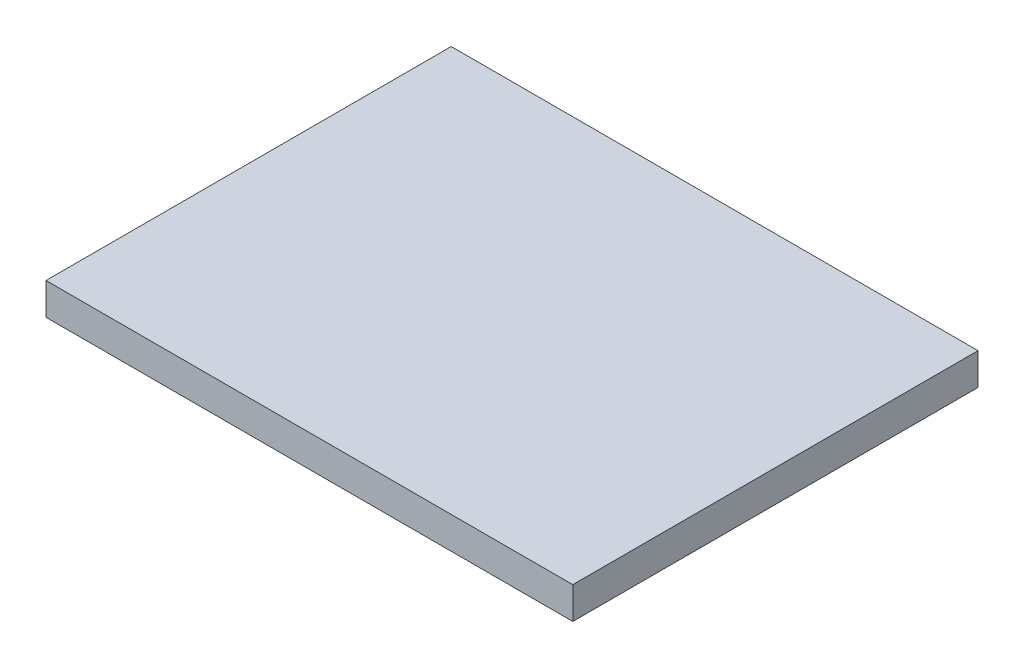
ISO-10303-21;
HEADER;
FILE_DESCRIPTION(('STEP AP214'),'2;1');
FILE_NAME('part.step','',(''),(''),'','','');
FILE_SCHEMA(('AUTOMOTIVE_DESIGN { 1 0 10303 214 1 1 1 1 }'));
ENDSEC;
DATA;
#1=APPLICATION_CONTEXT('core data for automotive mechanical design processes');
#2=APPLICATION_PROTOCOL_DEFINITION('international standard','automotive_design',2000,#1);
#3=PRODUCT_CONTEXT('',#1,'mechanical');
#4=PRODUCT('Part','Part','',(#3));
#5=PRODUCT_RELATED_PRODUCT_CATEGORY('part','',(#4));
#6=PRODUCT_DEFINITION_FORMATION('','',#4);
#7=PRODUCT_DEFINITION_CONTEXT('part definition',#1,'design');
#8=PRODUCT_DEFINITION('design','',#6,#7);
#9=PRODUCT_DEFINITION_SHAPE('','',#8);
#10=(LENGTH_UNIT() NAMED_UNIT(*) SI_UNIT(.MILLI.,.METRE.));
#11=(NAMED_UNIT(*) PLANE_ANGLE_UNIT() SI_UNIT($,.RADIAN.));
#12=(NAMED_UNIT(*) SI_UNIT($,.STERADIAN.) SOLID_ANGLE_UNIT());
#13=UNCERTAINTY_MEASURE_WITH_UNIT(LENGTH_MEASURE(1.E-05),#10,'distance_accuracy_value','');
#14=(GEOMETRIC_REPRESENTATION_CONTEXT(3) GLOBAL_UNCERTAINTY_ASSIGNED_CONTEXT((#13)) GLOBAL_UNIT_ASSIGNED_CONTEXT((#10,
#11,#12)) REPRESENTATION_CONTEXT('',''));
#15=CARTESIAN_POINT('',(0.,0.,0.));
#16=DIRECTION('',(0.,0.,1.));
#17=DIRECTION('',(1.,0.,0.));
#18=AXIS2_PLACEMENT_3D('',#15,#16,#17);
#19=CARTESIAN_POINT('',(-104.16403785489,10.,-64.8020504731861));
#20=DIRECTION('',(1.,0.,0.));
#21=DIRECTION('',(0.,0.,-1.));
#22=AXIS2_PLACEMENT_3D('',#19,#20,#21);
#23=PLANE('',#22);
#24=DIRECTION('',(0.,0.,1.));
#25=VECTOR('',#24,1.);
#26=CARTESIAN_POINT('',(-104.16403785489,0.,-64.8020504731861));
#27=LINE('',#26,#25);
#28=CARTESIAN_POINT('',(-104.16403785489,0.,-64.8020504731861));
#29=VERTEX_POINT('',#28);
#30=CARTESIAN_POINT('',(-104.16403785489,0.,62.1979495268139));
#31=VERTEX_POINT('',#30);
#32=EDGE_CURVE('E100',#29,#31,#27,.T.);
#33=ORIENTED_EDGE('',*,*,#32,.T.);
#34=DIRECTION('',(0.,-1.,0.));
#35=VECTOR('',#34,1.);
#36=CARTESIAN_POINT('',(-104.16403785489,10.,62.1979495268139));
#37=LINE('',#36,#35);
#38=CARTESIAN_POINT('',(-104.16403785489,10.,62.1979495268139));
#39=VERTEX_POINT('',#38);
#40=EDGE_CURVE('E11',#39,#31,#37,.T.);
#41=ORIENTED_EDGE('',*,*,#40,.F.);
#42=DIRECTION('',(0.,0.,1.));
#43=VECTOR('',#42,1.);
#44=CARTESIAN_POINT('',(-104.16403785489,10.,-64.8020504731861));
#45=LINE('',#44,#43);
#46=CARTESIAN_POINT('',(-104.16403785489,10.,-64.8020504731861));
#47=VERTEX_POINT('',#46);
#48=EDGE_CURVE('E88',#47,#39,#45,.T.);
#49=ORIENTED_EDGE('',*,*,#48,.F.);
#50=DIRECTION('',(0.,-1.,0.));
#51=VECTOR('',#50,1.);
#52=CARTESIAN_POINT('',(-104.16403785489,10.,-64.8020504731861));
#53=LINE('',#52,#51);
#54=EDGE_CURVE('E96',#47,#29,#53,.T.);
#55=ORIENTED_EDGE('',*,*,#54,.T.);
#56=EDGE_LOOP('',(#33,#41,#49,#55));
#57=FACE_BOUND('',#56,.T.);
#58=ADVANCED_FACE('F37',(#57),#23,.F.);
#59=CARTESIAN_POINT('',(-104.16403785489,10.,62.1979495268139));
#60=DIRECTION('',(0.,0.,-1.));
#61=DIRECTION('',(-1.,0.,0.));
#62=AXIS2_PLACEMENT_3D('',#59,#60,#61);
#63=PLANE('',#62);
#64=DIRECTION('',(1.,0.,0.));
#65=VECTOR('',#64,1.);
#66=CARTESIAN_POINT('',(-104.16403785489,0.,62.1979495268139));
#67=LINE('',#66,#65);
#68=CARTESIAN_POINT('',(60.9359621451104,0.,62.1979495268139));
#69=VERTEX_POINT('',#68);
#70=EDGE_CURVE('E92',#31,#69,#67,.T.);
#71=ORIENTED_EDGE('',*,*,#70,.T.);
#72=DIRECTION('',(0.,-1.,0.));
#73=VECTOR('',#72,1.);
#74=CARTESIAN_POINT('',(60.9359621451104,10.,62.1979495268139));
#75=LINE('',#74,#73);
#76=CARTESIAN_POINT('',(60.9359621451104,10.,62.1979495268139));
#77=VERTEX_POINT('',#76);
#78=EDGE_CURVE('E45',#77,#69,#75,.T.);
#79=ORIENTED_EDGE('',*,*,#78,.F.);
#80=DIRECTION('',(1.,0.,0.));
#81=VECTOR('',#80,1.);
#82=CARTESIAN_POINT('',(-104.16403785489,10.,62.1979495268139));
#83=LINE('',#82,#81);
#84=EDGE_CURVE('E83',#39,#77,#83,.T.);
#85=ORIENTED_EDGE('',*,*,#84,.F.);
#86=ORIENTED_EDGE('',*,*,#40,.T.);
#87=EDGE_LOOP('',(#71,#79,#85,#86));
#88=FACE_BOUND('',#87,.T.);
#89=ADVANCED_FACE('F91',(#88),#63,.F.);
#90=CARTESIAN_POINT('',(60.9359621451104,10.,-64.8020504731861));
#91=DIRECTION('',(-1.,0.,0.));
#92=DIRECTION('',(0.,0.,1.));
#93=AXIS2_PLACEMENT_3D('',#90,#91,#92);
#94=PLANE('',#93);
#95=DIRECTION('',(0.,0.,-1.));
#96=VECTOR('',#95,1.);
#97=CARTESIAN_POINT('',(60.9359621451104,0.,-64.8020504731861));
#98=LINE('',#97,#96);
#99=CARTESIAN_POINT('',(60.9359621451104,0.,-64.8020504731861));
#100=VERTEX_POINT('',#99);
#101=EDGE_CURVE('E70',#69,#100,#98,.T.);
#102=ORIENTED_EDGE('',*,*,#101,.T.);
#103=DIRECTION('',(0.,-1.,0.));
#104=VECTOR('',#103,1.);
#105=CARTESIAN_POINT('',(60.9359621451104,10.,-64.8020504731861));
#106=LINE('',#105,#104);
#107=CARTESIAN_POINT('',(60.9359621451104,10.,-64.8020504731861));
#108=VERTEX_POINT('',#107);
#109=EDGE_CURVE('E93',#108,#100,#106,.T.);
#110=ORIENTED_EDGE('',*,*,#109,.F.);
#111=DIRECTION('',(0.,0.,-1.));
#112=VECTOR('',#111,1.);
#113=CARTESIAN_POINT('',(60.9359621451104,10.,-64.8020504731861));
#114=LINE('',#113,#112);
#115=EDGE_CURVE('E86',#77,#108,#114,.T.);
#116=ORIENTED_EDGE('',*,*,#115,.F.);
#117=ORIENTED_EDGE('',*,*,#78,.T.);
#118=EDGE_LOOP('',(#102,#110,#116,#117));
#119=FACE_BOUND('',#118,.T.);
#120=ADVANCED_FACE('F94',(#119),#94,.F.);
#121=CARTESIAN_POINT('',(-104.16403785489,10.,-64.8020504731861));
#122=DIRECTION('',(0.,0.,1.));
#123=DIRECTION('',(1.,0.,0.));
#124=AXIS2_PLACEMENT_3D('',#121,#122,#123);
#125=PLANE('',#124);
#126=DIRECTION('',(-1.,0.,0.));
#127=VECTOR('',#126,1.);
#128=CARTESIAN_POINT('',(-104.16403785489,0.,-64.8020504731861));
#129=LINE('',#128,#127);
#130=EDGE_CURVE('E76',#100,#29,#129,.T.);
#131=ORIENTED_EDGE('',*,*,#130,.T.);
#132=ORIENTED_EDGE('',*,*,#54,.F.);
#133=DIRECTION('',(-1.,0.,0.));
#134=VECTOR('',#133,1.);
#135=CARTESIAN_POINT('',(-104.16403785489,10.,-64.8020504731861));
#136=LINE('',#135,#134);
#137=EDGE_CURVE('E53',#108,#47,#136,.T.);
#138=ORIENTED_EDGE('',*,*,#137,.F.);
#139=ORIENTED_EDGE('',*,*,#109,.T.);
#140=EDGE_LOOP('',(#131,#132,#138,#139));
#141=FACE_BOUND('',#140,.T.);
#142=ADVANCED_FACE('F107',(#141),#125,.F.);
#143=CARTESIAN_POINT('',(0.,10.,0.));
#144=DIRECTION('',(0.,1.,0.));
#145=DIRECTION('',(0.,0.,1.));
#146=AXIS2_PLACEMENT_3D('',#143,#144,#145);
#147=PLANE('',#146);
#148=ORIENTED_EDGE('',*,*,#48,.T.);
#149=ORIENTED_EDGE('',*,*,#84,.T.);
#150=ORIENTED_EDGE('',*,*,#115,.T.);
#151=ORIENTED_EDGE('',*,*,#137,.T.);
#152=EDGE_LOOP('',(#148,#149,#150,#151));
#153=FACE_BOUND('',#152,.T.);
#154=ADVANCED_FACE('F84',(#153),#147,.T.);
#155=CARTESIAN_POINT('',(0.,0.,0.));
#156=DIRECTION('',(0.,1.,0.));
#157=DIRECTION('',(0.,0.,1.));
#158=AXIS2_PLACEMENT_3D('',#155,#156,#157);
#159=PLANE('',#158);
#160=ORIENTED_EDGE('',*,*,#32,.F.);
#161=ORIENTED_EDGE('',*,*,#130,.F.);
#162=ORIENTED_EDGE('',*,*,#101,.F.);
#163=ORIENTED_EDGE('',*,*,#70,.F.);
#164=EDGE_LOOP('',(#160,#161,#162,#163));
#165=FACE_BOUND('',#164,.T.);
#166=ADVANCED_FACE('F110',(#165),#159,.F.);
#167=CLOSED_SHELL('',(#58,#89,#120,#142,#154,#166));
#168=MANIFOLD_SOLID_BREP('B2',#167);
#169=ADVANCED_BREP_SHAPE_REPRESENTATION('',(#18,#168),#14);
#170=SHAPE_DEFINITION_REPRESENTATION(#9,#169);
ENDSEC;
END-ISO-10303-21;
